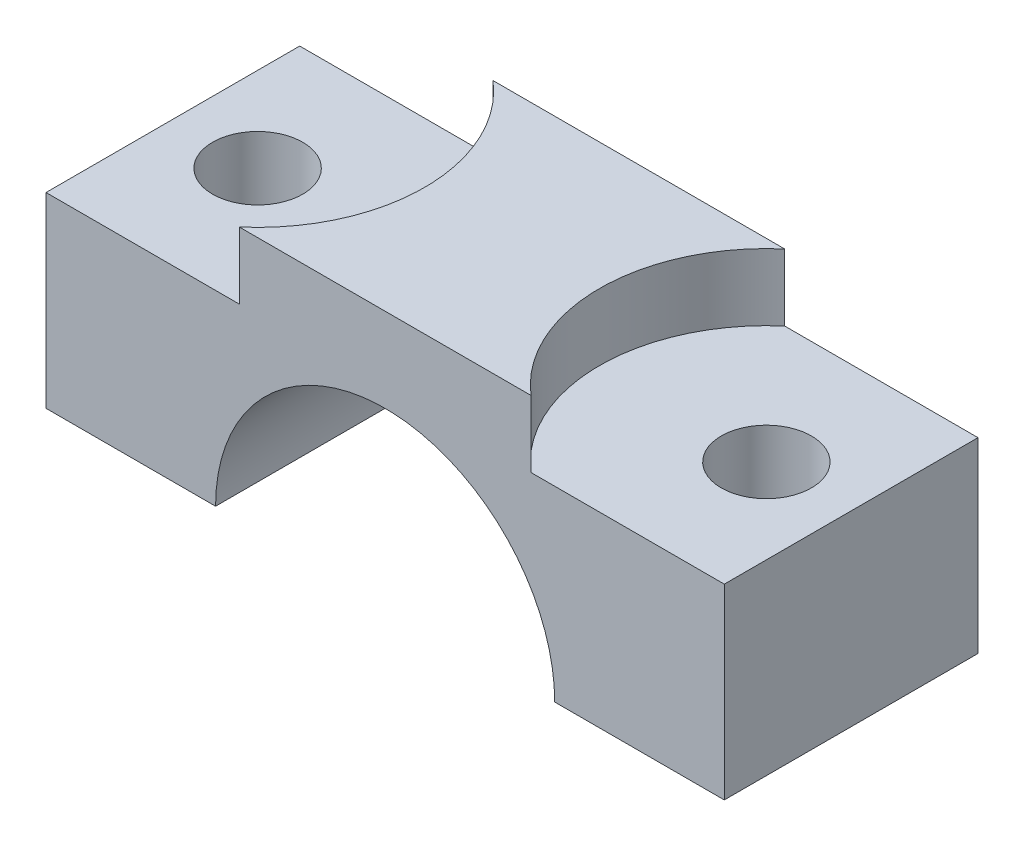
ISO-10303-21;
HEADER;
FILE_DESCRIPTION(('STEP AP214'),'2;1');
FILE_NAME('part.step','',(''),(''),'','','');
FILE_SCHEMA(('AUTOMOTIVE_DESIGN { 1 0 10303 214 1 1 1 1 }'));
ENDSEC;
DATA;
#1=APPLICATION_CONTEXT('core data for automotive mechanical design processes');
#2=APPLICATION_PROTOCOL_DEFINITION('international standard','automotive_design',2000,#1);
#3=PRODUCT_CONTEXT('',#1,'mechanical');
#4=PRODUCT('Part','Part','',(#3));
#5=PRODUCT_RELATED_PRODUCT_CATEGORY('part','',(#4));
#6=PRODUCT_DEFINITION_FORMATION('','',#4);
#7=PRODUCT_DEFINITION_CONTEXT('part definition',#1,'design');
#8=PRODUCT_DEFINITION('design','',#6,#7);
#9=PRODUCT_DEFINITION_SHAPE('','',#8);
#10=(LENGTH_UNIT() NAMED_UNIT(*) SI_UNIT(.MILLI.,.METRE.));
#11=(NAMED_UNIT(*) PLANE_ANGLE_UNIT() SI_UNIT($,.RADIAN.));
#12=(NAMED_UNIT(*) SI_UNIT($,.STERADIAN.) SOLID_ANGLE_UNIT());
#13=UNCERTAINTY_MEASURE_WITH_UNIT(LENGTH_MEASURE(1.E-05),#10,'distance_accuracy_value','');
#14=(GEOMETRIC_REPRESENTATION_CONTEXT(3) GLOBAL_UNCERTAINTY_ASSIGNED_CONTEXT((#13)) GLOBAL_UNIT_ASSIGNED_CONTEXT((#10,
#11,#12)) REPRESENTATION_CONTEXT('',''));
#15=CARTESIAN_POINT('',(0.,0.,0.));
#16=DIRECTION('',(0.,0.,1.));
#17=DIRECTION('',(1.,0.,0.));
#18=AXIS2_PLACEMENT_3D('',#15,#16,#17);
#19=CARTESIAN_POINT('',(0.,-9.5,9.5));
#20=DIRECTION('',(0.,0.,-1.));
#21=DIRECTION('',(-1.,0.,0.));
#22=AXIS2_PLACEMENT_3D('',#19,#20,#21);
#23=CYLINDRICAL_SURFACE('',#22,12.7);
#24=CARTESIAN_POINT('',(0.,-9.5,-9.5));
#25=DIRECTION('',(0.,0.,1.));
#26=DIRECTION('',(1.,0.,0.));
#27=AXIS2_PLACEMENT_3D('',#24,#25,#26);
#28=CIRCLE('',#27,12.7);
#29=CARTESIAN_POINT('',(12.7,-9.5,-9.5));
#30=VERTEX_POINT('',#29);
#31=CARTESIAN_POINT('',(-12.7,-9.5,-9.5));
#32=VERTEX_POINT('',#31);
#33=EDGE_CURVE('E193',#30,#32,#28,.T.);
#34=ORIENTED_EDGE('',*,*,#33,.F.);
#35=DIRECTION('',(0.,0.,-1.));
#36=VECTOR('',#35,1.);
#37=CARTESIAN_POINT('',(12.7,-9.5,9.5));
#38=LINE('',#37,#36);
#39=CARTESIAN_POINT('',(12.7,-9.5,9.5));
#40=VERTEX_POINT('',#39);
#41=EDGE_CURVE('E220',#40,#30,#38,.T.);
#42=ORIENTED_EDGE('',*,*,#41,.F.);
#43=CARTESIAN_POINT('',(0.,-9.5,9.5));
#44=DIRECTION('',(0.,0.,1.));
#45=DIRECTION('',(1.,0.,0.));
#46=AXIS2_PLACEMENT_3D('',#43,#44,#45);
#47=CIRCLE('',#46,12.7);
#48=CARTESIAN_POINT('',(-12.7,-9.5,9.5));
#49=VERTEX_POINT('',#48);
#50=EDGE_CURVE('E173',#40,#49,#47,.T.);
#51=ORIENTED_EDGE('',*,*,#50,.T.);
#52=DIRECTION('',(0.,0.,-1.));
#53=VECTOR('',#52,1.);
#54=CARTESIAN_POINT('',(-12.7,-9.5,9.5));
#55=LINE('',#54,#53);
#56=EDGE_CURVE('E209',#49,#32,#55,.T.);
#57=ORIENTED_EDGE('',*,*,#56,.T.);
#58=EDGE_LOOP('',(#34,#42,#51,#57));
#59=FACE_BOUND('',#58,.T.);
#60=ADVANCED_FACE('F47',(#59),#23,.F.);
#61=CARTESIAN_POINT('',(0.,-9.5,9.5));
#62=DIRECTION('',(0.,1.,0.));
#63=DIRECTION('',(0.,0.,1.));
#64=AXIS2_PLACEMENT_3D('',#61,#62,#63);
#65=PLANE('',#64);
#66=CARTESIAN_POINT('',(19.05,-9.5,0.));
#67=DIRECTION('',(0.,1.,0.));
#68=DIRECTION('',(0.,0.,1.));
#69=AXIS2_PLACEMENT_3D('',#66,#67,#68);
#70=CIRCLE('',#69,3.37499999999994);
#71=CARTESIAN_POINT('',(19.05,-9.5,3.37499999999994));
#72=VERTEX_POINT('',#71);
#73=EDGE_CURVE('E50',#72,#72,#70,.T.);
#74=ORIENTED_EDGE('',*,*,#73,.T.);
#75=EDGE_LOOP('',(#74));
#76=FACE_BOUND('',#75,.T.);
#77=DIRECTION('',(1.,0.,0.));
#78=VECTOR('',#77,1.);
#79=CARTESIAN_POINT('',(0.,-9.5,-9.5));
#80=LINE('',#79,#78);
#81=CARTESIAN_POINT('',(25.4,-9.5,-9.5));
#82=VERTEX_POINT('',#81);
#83=EDGE_CURVE('E197',#30,#82,#80,.T.);
#84=ORIENTED_EDGE('',*,*,#83,.T.);
#85=DIRECTION('',(0.,0.,-1.));
#86=VECTOR('',#85,1.);
#87=CARTESIAN_POINT('',(25.4,-9.5,9.5));
#88=LINE('',#87,#86);
#89=CARTESIAN_POINT('',(25.4,-9.5,9.5));
#90=VERTEX_POINT('',#89);
#91=EDGE_CURVE('E216',#90,#82,#88,.T.);
#92=ORIENTED_EDGE('',*,*,#91,.F.);
#93=DIRECTION('',(1.,0.,0.));
#94=VECTOR('',#93,1.);
#95=CARTESIAN_POINT('',(0.,-9.5,9.5));
#96=LINE('',#95,#94);
#97=EDGE_CURVE('E177',#40,#90,#96,.T.);
#98=ORIENTED_EDGE('',*,*,#97,.F.);
#99=ORIENTED_EDGE('',*,*,#41,.T.);
#100=EDGE_LOOP('',(#84,#92,#98,#99));
#101=FACE_BOUND('',#100,.T.);
#102=ADVANCED_FACE('F245',(#76,#101),#65,.F.);
#103=CARTESIAN_POINT('',(25.4,0.,9.5));
#104=DIRECTION('',(1.,0.,0.));
#105=DIRECTION('',(0.,1.,0.));
#106=AXIS2_PLACEMENT_3D('',#103,#104,#105);
#107=PLANE('',#106);
#108=DIRECTION('',(0.,0.,-1.));
#109=VECTOR('',#108,1.);
#110=CARTESIAN_POINT('',(25.4,4.5,9.5));
#111=LINE('',#110,#109);
#112=CARTESIAN_POINT('',(25.4,4.5,9.5));
#113=VERTEX_POINT('',#112);
#114=CARTESIAN_POINT('',(25.4,4.5,-9.5));
#115=VERTEX_POINT('',#114);
#116=EDGE_CURVE('E130',#113,#115,#111,.T.);
#117=ORIENTED_EDGE('',*,*,#116,.F.);
#118=DIRECTION('',(0.,-1.,0.));
#119=VECTOR('',#118,1.);
#120=CARTESIAN_POINT('',(25.4,0.,9.5));
#121=LINE('',#120,#119);
#122=EDGE_CURVE('E182',#113,#90,#121,.T.);
#123=ORIENTED_EDGE('',*,*,#122,.T.);
#124=ORIENTED_EDGE('',*,*,#91,.T.);
#125=DIRECTION('',(0.,-1.,0.));
#126=VECTOR('',#125,1.);
#127=CARTESIAN_POINT('',(25.4,0.,-9.5));
#128=LINE('',#127,#126);
#129=EDGE_CURVE('E201',#115,#82,#128,.T.);
#130=ORIENTED_EDGE('',*,*,#129,.F.);
#131=EDGE_LOOP('',(#117,#123,#124,#130));
#132=FACE_BOUND('',#131,.T.);
#133=ADVANCED_FACE('F239',(#132),#107,.T.);
#134=CARTESIAN_POINT('',(0.,9.5,9.5));
#135=DIRECTION('',(0.,1.,0.));
#136=DIRECTION('',(0.,0.,1.));
#137=AXIS2_PLACEMENT_3D('',#134,#135,#136);
#138=PLANE('',#137);
#139=CARTESIAN_POINT('',(19.05,9.5,0.));
#140=DIRECTION('',(0.,1.,0.));
#141=DIRECTION('',(0.,0.,1.));
#142=AXIS2_PLACEMENT_3D('',#139,#140,#141);
#143=CIRCLE('',#142,12.5);
#144=CARTESIAN_POINT('',(10.925961595364,9.5,-9.5));
#145=VERTEX_POINT('',#144);
#146=CARTESIAN_POINT('',(10.925961595364,9.5,9.5));
#147=VERTEX_POINT('',#146);
#148=EDGE_CURVE('E63',#145,#147,#143,.T.);
#149=ORIENTED_EDGE('',*,*,#148,.F.);
#150=DIRECTION('',(1.,0.,0.));
#151=VECTOR('',#150,1.);
#152=CARTESIAN_POINT('',(0.,9.5,-9.5));
#153=LINE('',#152,#151);
#154=CARTESIAN_POINT('',(-10.925961595364,9.5,-9.5));
#155=VERTEX_POINT('',#154);
#156=EDGE_CURVE('E144',#155,#145,#153,.T.);
#157=ORIENTED_EDGE('',*,*,#156,.F.);
#158=CARTESIAN_POINT('',(-19.05,9.5,0.));
#159=DIRECTION('',(0.,1.,0.));
#160=DIRECTION('',(0.,0.,1.));
#161=AXIS2_PLACEMENT_3D('',#158,#159,#160);
#162=CIRCLE('',#161,12.5);
#163=CARTESIAN_POINT('',(-10.925961595364,9.5,9.5));
#164=VERTEX_POINT('',#163);
#165=EDGE_CURVE('E153',#164,#155,#162,.T.);
#166=ORIENTED_EDGE('',*,*,#165,.F.);
#167=DIRECTION('',(1.,0.,0.));
#168=VECTOR('',#167,1.);
#169=CARTESIAN_POINT('',(0.,9.5,9.5));
#170=LINE('',#169,#168);
#171=EDGE_CURVE('E186',#164,#147,#170,.T.);
#172=ORIENTED_EDGE('',*,*,#171,.T.);
#173=EDGE_LOOP('',(#149,#157,#166,#172));
#174=FACE_BOUND('',#173,.T.);
#175=ADVANCED_FACE('F285',(#174),#138,.T.);
#176=CARTESIAN_POINT('',(-25.4,0.,9.5));
#177=DIRECTION('',(1.,0.,0.));
#178=DIRECTION('',(0.,1.,0.));
#179=AXIS2_PLACEMENT_3D('',#176,#177,#178);
#180=PLANE('',#179);
#181=DIRECTION('',(0.,-1.,0.));
#182=VECTOR('',#181,1.);
#183=CARTESIAN_POINT('',(-25.4,0.,9.5));
#184=LINE('',#183,#182);
#185=CARTESIAN_POINT('',(-25.4,4.5,9.5));
#186=VERTEX_POINT('',#185);
#187=CARTESIAN_POINT('',(-25.4,-9.5,9.5));
#188=VERTEX_POINT('',#187);
#189=EDGE_CURVE('E190',#186,#188,#184,.T.);
#190=ORIENTED_EDGE('',*,*,#189,.F.);
#191=DIRECTION('',(0.,0.,-1.));
#192=VECTOR('',#191,1.);
#193=CARTESIAN_POINT('',(-25.4,4.5,9.5));
#194=LINE('',#193,#192);
#195=CARTESIAN_POINT('',(-25.4,4.5,-9.5));
#196=VERTEX_POINT('',#195);
#197=EDGE_CURVE('E162',#186,#196,#194,.T.);
#198=ORIENTED_EDGE('',*,*,#197,.T.);
#199=DIRECTION('',(0.,-1.,0.));
#200=VECTOR('',#199,1.);
#201=CARTESIAN_POINT('',(-25.4,0.,-9.5));
#202=LINE('',#201,#200);
#203=CARTESIAN_POINT('',(-25.4,-9.5,-9.5));
#204=VERTEX_POINT('',#203);
#205=EDGE_CURVE('E206',#196,#204,#202,.T.);
#206=ORIENTED_EDGE('',*,*,#205,.T.);
#207=DIRECTION('',(0.,0.,-1.));
#208=VECTOR('',#207,1.);
#209=CARTESIAN_POINT('',(-25.4,-9.5,9.5));
#210=LINE('',#209,#208);
#211=EDGE_CURVE('E212',#188,#204,#210,.T.);
#212=ORIENTED_EDGE('',*,*,#211,.F.);
#213=EDGE_LOOP('',(#190,#198,#206,#212));
#214=FACE_BOUND('',#213,.T.);
#215=ADVANCED_FACE('F289',(#214),#180,.F.);
#216=CARTESIAN_POINT('',(-19.05,-9.5,0.));
#217=DIRECTION('',(0.,1.,0.));
#218=DIRECTION('',(0.,0.,1.));
#219=AXIS2_PLACEMENT_3D('',#216,#217,#218);
#220=CIRCLE('',#219,3.37499999999994);
#221=CARTESIAN_POINT('',(-19.05,-9.5,3.37499999999994));
#222=VERTEX_POINT('',#221);
#223=EDGE_CURVE('E172',#222,#222,#220,.T.);
#224=ORIENTED_EDGE('',*,*,#223,.T.);
#225=EDGE_LOOP('',(#224));
#226=FACE_BOUND('',#225,.T.);
#227=EDGE_CURVE('E178',#204,#32,#80,.T.);
#228=ORIENTED_EDGE('',*,*,#227,.T.);
#229=ORIENTED_EDGE('',*,*,#56,.F.);
#230=EDGE_CURVE('E183',#188,#49,#96,.T.);
#231=ORIENTED_EDGE('',*,*,#230,.F.);
#232=ORIENTED_EDGE('',*,*,#211,.T.);
#233=EDGE_LOOP('',(#228,#229,#231,#232));
#234=FACE_BOUND('',#233,.T.);
#235=ADVANCED_FACE('F254',(#226,#234),#65,.F.);
#236=CARTESIAN_POINT('',(0.,0.,9.5));
#237=DIRECTION('',(0.,0.,1.));
#238=DIRECTION('',(1.,0.,0.));
#239=AXIS2_PLACEMENT_3D('',#236,#237,#238);
#240=PLANE('',#239);
#241=DIRECTION('',(1.,0.,0.));
#242=VECTOR('',#241,1.);
#243=CARTESIAN_POINT('',(0.,4.5,9.5));
#244=LINE('',#243,#242);
#245=CARTESIAN_POINT('',(10.925961595364,4.5,9.5));
#246=VERTEX_POINT('',#245);
#247=EDGE_CURVE('E56',#246,#113,#244,.T.);
#248=ORIENTED_EDGE('',*,*,#247,.F.);
#249=DIRECTION('',(0.,1.,0.));
#250=VECTOR('',#249,1.);
#251=CARTESIAN_POINT('',(10.925961595364,9.5,9.5));
#252=LINE('',#251,#250);
#253=EDGE_CURVE('E136',#147,#246,#252,.F.);
#254=ORIENTED_EDGE('',*,*,#253,.F.);
#255=ORIENTED_EDGE('',*,*,#171,.F.);
#256=DIRECTION('',(0.,1.,0.));
#257=VECTOR('',#256,1.);
#258=CARTESIAN_POINT('',(-10.925961595364,9.5,9.5));
#259=LINE('',#258,#257);
#260=CARTESIAN_POINT('',(-10.925961595364,4.5,9.5));
#261=VERTEX_POINT('',#260);
#262=EDGE_CURVE('E169',#261,#164,#259,.T.);
#263=ORIENTED_EDGE('',*,*,#262,.F.);
#264=DIRECTION('',(1.,0.,0.));
#265=VECTOR('',#264,1.);
#266=CARTESIAN_POINT('',(0.,4.5,9.5));
#267=LINE('',#266,#265);
#268=EDGE_CURVE('E166',#186,#261,#267,.T.);
#269=ORIENTED_EDGE('',*,*,#268,.F.);
#270=ORIENTED_EDGE('',*,*,#189,.T.);
#271=ORIENTED_EDGE('',*,*,#230,.T.);
#272=ORIENTED_EDGE('',*,*,#50,.F.);
#273=ORIENTED_EDGE('',*,*,#97,.T.);
#274=ORIENTED_EDGE('',*,*,#122,.F.);
#275=EDGE_LOOP('',(#248,#254,#255,#263,#269,#270,#271,#272,#273,#274));
#276=FACE_BOUND('',#275,.T.);
#277=ADVANCED_FACE('F240',(#276),#240,.T.);
#278=CARTESIAN_POINT('',(0.,0.,-9.5));
#279=DIRECTION('',(0.,0.,1.));
#280=DIRECTION('',(1.,0.,0.));
#281=AXIS2_PLACEMENT_3D('',#278,#279,#280);
#282=PLANE('',#281);
#283=DIRECTION('',(0.,1.,0.));
#284=VECTOR('',#283,1.);
#285=CARTESIAN_POINT('',(10.925961595364,9.5,-9.5));
#286=LINE('',#285,#284);
#287=CARTESIAN_POINT('',(10.925961595364,4.5,-9.5));
#288=VERTEX_POINT('',#287);
#289=EDGE_CURVE('E135',#145,#288,#286,.F.);
#290=ORIENTED_EDGE('',*,*,#289,.T.);
#291=DIRECTION('',(1.,0.,0.));
#292=VECTOR('',#291,1.);
#293=CARTESIAN_POINT('',(0.,4.5,-9.5));
#294=LINE('',#293,#292);
#295=EDGE_CURVE('E11',#288,#115,#294,.T.);
#296=ORIENTED_EDGE('',*,*,#295,.T.);
#297=ORIENTED_EDGE('',*,*,#129,.T.);
#298=ORIENTED_EDGE('',*,*,#83,.F.);
#299=ORIENTED_EDGE('',*,*,#33,.T.);
#300=ORIENTED_EDGE('',*,*,#227,.F.);
#301=ORIENTED_EDGE('',*,*,#205,.F.);
#302=DIRECTION('',(1.,0.,0.));
#303=VECTOR('',#302,1.);
#304=CARTESIAN_POINT('',(0.,4.5,-9.5));
#305=LINE('',#304,#303);
#306=CARTESIAN_POINT('',(-10.925961595364,4.5,-9.5));
#307=VERTEX_POINT('',#306);
#308=EDGE_CURVE('E223',#196,#307,#305,.T.);
#309=ORIENTED_EDGE('',*,*,#308,.T.);
#310=DIRECTION('',(0.,1.,0.));
#311=VECTOR('',#310,1.);
#312=CARTESIAN_POINT('',(-10.925961595364,9.5,-9.5));
#313=LINE('',#312,#311);
#314=EDGE_CURVE('E227',#307,#155,#313,.T.);
#315=ORIENTED_EDGE('',*,*,#314,.T.);
#316=ORIENTED_EDGE('',*,*,#156,.T.);
#317=EDGE_LOOP('',(#290,#296,#297,#298,#299,#300,#301,#309,#315,#316));
#318=FACE_BOUND('',#317,.T.);
#319=ADVANCED_FACE('F141',(#318),#282,.F.);
#320=CARTESIAN_POINT('',(-19.05,9.5,0.));
#321=DIRECTION('',(0.,1.,0.));
#322=DIRECTION('',(0.,0.,1.));
#323=AXIS2_PLACEMENT_3D('',#320,#321,#322);
#324=CYLINDRICAL_SURFACE('',#323,3.37499999999994);
#325=CARTESIAN_POINT('',(-19.05,4.5,0.));
#326=DIRECTION('',(0.,1.,0.));
#327=DIRECTION('',(0.,0.,1.));
#328=AXIS2_PLACEMENT_3D('',#325,#326,#327);
#329=CIRCLE('',#328,3.37499999999996);
#330=CARTESIAN_POINT('',(-19.05,4.5,3.37499999999996));
#331=VERTEX_POINT('',#330);
#332=EDGE_CURVE('E158',#331,#331,#329,.T.);
#333=ORIENTED_EDGE('',*,*,#332,.T.);
#334=EDGE_LOOP('',(#333));
#335=FACE_BOUND('',#334,.T.);
#336=ORIENTED_EDGE('',*,*,#223,.F.);
#337=EDGE_LOOP('',(#336));
#338=FACE_BOUND('',#337,.T.);
#339=ADVANCED_FACE('F299',(#335,#338),#324,.F.);
#340=CARTESIAN_POINT('',(-15.675,4.5,0.));
#341=DIRECTION('',(0.,-1.,0.));
#342=DIRECTION('',(0.,0.,-1.));
#343=AXIS2_PLACEMENT_3D('',#340,#341,#342);
#344=PLANE('',#343);
#345=ORIENTED_EDGE('',*,*,#268,.T.);
#346=CARTESIAN_POINT('',(-19.05,4.5,0.));
#347=DIRECTION('',(0.,1.,0.));
#348=DIRECTION('',(0.,0.,1.));
#349=AXIS2_PLACEMENT_3D('',#346,#347,#348);
#350=CIRCLE('',#349,12.5);
#351=EDGE_CURVE('E71',#261,#307,#350,.T.);
#352=ORIENTED_EDGE('',*,*,#351,.T.);
#353=ORIENTED_EDGE('',*,*,#308,.F.);
#354=ORIENTED_EDGE('',*,*,#197,.F.);
#355=EDGE_LOOP('',(#345,#352,#353,#354));
#356=FACE_BOUND('',#355,.T.);
#357=ORIENTED_EDGE('',*,*,#332,.F.);
#358=EDGE_LOOP('',(#357));
#359=FACE_BOUND('',#358,.T.);
#360=ADVANCED_FACE('F273',(#356,#359),#344,.F.);
#361=CARTESIAN_POINT('',(-19.05,9.5,0.));
#362=DIRECTION('',(0.,1.,0.));
#363=DIRECTION('',(0.,0.,1.));
#364=AXIS2_PLACEMENT_3D('',#361,#362,#363);
#365=CYLINDRICAL_SURFACE('',#364,12.5);
#366=ORIENTED_EDGE('',*,*,#262,.T.);
#367=ORIENTED_EDGE('',*,*,#165,.T.);
#368=ORIENTED_EDGE('',*,*,#314,.F.);
#369=ORIENTED_EDGE('',*,*,#351,.F.);
#370=EDGE_LOOP('',(#366,#367,#368,#369));
#371=FACE_BOUND('',#370,.T.);
#372=ADVANCED_FACE('F265',(#371),#365,.F.);
#373=CARTESIAN_POINT('',(19.05,9.5,0.));
#374=DIRECTION('',(0.,1.,0.));
#375=DIRECTION('',(0.,0.,1.));
#376=AXIS2_PLACEMENT_3D('',#373,#374,#375);
#377=CYLINDRICAL_SURFACE('',#376,3.37499999999994);
#378=CARTESIAN_POINT('',(19.05,4.5,0.));
#379=DIRECTION('',(0.,1.,0.));
#380=DIRECTION('',(0.,0.,1.));
#381=AXIS2_PLACEMENT_3D('',#378,#379,#380);
#382=CIRCLE('',#381,3.37499999999996);
#383=CARTESIAN_POINT('',(19.05,4.5,3.37499999999996));
#384=VERTEX_POINT('',#383);
#385=EDGE_CURVE('E138',#384,#384,#382,.T.);
#386=ORIENTED_EDGE('',*,*,#385,.T.);
#387=EDGE_LOOP('',(#386));
#388=FACE_BOUND('',#387,.T.);
#389=ORIENTED_EDGE('',*,*,#73,.F.);
#390=EDGE_LOOP('',(#389));
#391=FACE_BOUND('',#390,.T.);
#392=ADVANCED_FACE('F263',(#388,#391),#377,.F.);
#393=CARTESIAN_POINT('',(19.05,9.5,0.));
#394=DIRECTION('',(0.,1.,0.));
#395=DIRECTION('',(0.,0.,1.));
#396=AXIS2_PLACEMENT_3D('',#393,#394,#395);
#397=CYLINDRICAL_SURFACE('',#396,12.5);
#398=ORIENTED_EDGE('',*,*,#148,.T.);
#399=ORIENTED_EDGE('',*,*,#253,.T.);
#400=CARTESIAN_POINT('',(19.05,4.5,0.));
#401=DIRECTION('',(0.,1.,0.));
#402=DIRECTION('',(0.,0.,1.));
#403=AXIS2_PLACEMENT_3D('',#400,#401,#402);
#404=CIRCLE('',#403,12.5);
#405=EDGE_CURVE('E127',#288,#246,#404,.T.);
#406=ORIENTED_EDGE('',*,*,#405,.F.);
#407=ORIENTED_EDGE('',*,*,#289,.F.);
#408=EDGE_LOOP('',(#398,#399,#406,#407));
#409=FACE_BOUND('',#408,.T.);
#410=ADVANCED_FACE('F134',(#409),#397,.F.);
#411=CARTESIAN_POINT('',(22.425,4.5,0.));
#412=DIRECTION('',(0.,-1.,0.));
#413=DIRECTION('',(0.,0.,-1.));
#414=AXIS2_PLACEMENT_3D('',#411,#412,#413);
#415=PLANE('',#414);
#416=ORIENTED_EDGE('',*,*,#247,.T.);
#417=ORIENTED_EDGE('',*,*,#116,.T.);
#418=ORIENTED_EDGE('',*,*,#295,.F.);
#419=ORIENTED_EDGE('',*,*,#405,.T.);
#420=EDGE_LOOP('',(#416,#417,#418,#419));
#421=FACE_BOUND('',#420,.T.);
#422=ORIENTED_EDGE('',*,*,#385,.F.);
#423=EDGE_LOOP('',(#422));
#424=FACE_BOUND('',#423,.T.);
#425=ADVANCED_FACE('F125',(#421,#424),#415,.F.);
#426=CLOSED_SHELL('',(#60,#102,#133,#175,#215,#235,#277,#319,#339,#360,#372,#392,#410,#425));
#427=MANIFOLD_SOLID_BREP('B2',#426);
#428=ADVANCED_BREP_SHAPE_REPRESENTATION('',(#18,#427),#14);
#429=SHAPE_DEFINITION_REPRESENTATION(#9,#428);
ENDSEC;
END-ISO-10303-21;
